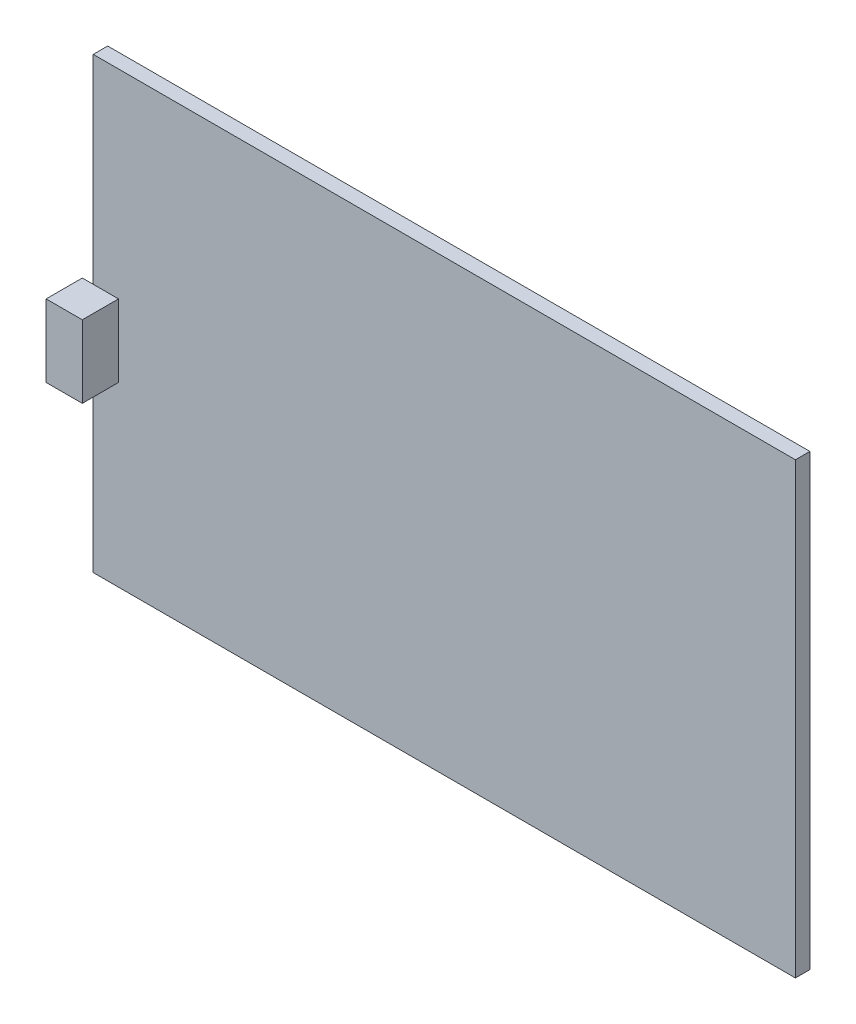
ISO-10303-21;
HEADER;
FILE_DESCRIPTION(('STEP AP214'),'2;1');
FILE_NAME('part.step','',(''),(''),'','','');
FILE_SCHEMA(('AUTOMOTIVE_DESIGN { 1 0 10303 214 1 1 1 1 }'));
ENDSEC;
DATA;
#1=APPLICATION_CONTEXT('core data for automotive mechanical design processes');
#2=APPLICATION_PROTOCOL_DEFINITION('international standard','automotive_design',2000,#1);
#3=PRODUCT_CONTEXT('',#1,'mechanical');
#4=PRODUCT('Part','Part','',(#3));
#5=PRODUCT_RELATED_PRODUCT_CATEGORY('part','',(#4));
#6=PRODUCT_DEFINITION_FORMATION('','',#4);
#7=PRODUCT_DEFINITION_CONTEXT('part definition',#1,'design');
#8=PRODUCT_DEFINITION('design','',#6,#7);
#9=PRODUCT_DEFINITION_SHAPE('','',#8);
#10=(LENGTH_UNIT() NAMED_UNIT(*) SI_UNIT(.MILLI.,.METRE.));
#11=(NAMED_UNIT(*) PLANE_ANGLE_UNIT() SI_UNIT($,.RADIAN.));
#12=(NAMED_UNIT(*) SI_UNIT($,.STERADIAN.) SOLID_ANGLE_UNIT());
#13=UNCERTAINTY_MEASURE_WITH_UNIT(LENGTH_MEASURE(1.E-05),#10,'distance_accuracy_value','');
#14=(GEOMETRIC_REPRESENTATION_CONTEXT(3) GLOBAL_UNCERTAINTY_ASSIGNED_CONTEXT((#13)) GLOBAL_UNIT_ASSIGNED_CONTEXT((#10,
#11,#12)) REPRESENTATION_CONTEXT('',''));
#15=CARTESIAN_POINT('',(0.,0.,0.));
#16=DIRECTION('',(0.,0.,1.));
#17=DIRECTION('',(1.,0.,0.));
#18=AXIS2_PLACEMENT_3D('',#15,#16,#17);
#19=CARTESIAN_POINT('',(-48.1177052875244,23.3333333333333,2.));
#20=DIRECTION('',(1.,0.,0.));
#21=DIRECTION('',(0.,1.,0.));
#22=AXIS2_PLACEMENT_3D('',#19,#20,#21);
#23=PLANE('',#22);
#24=DIRECTION('',(0.,-1.,0.));
#25=VECTOR('',#24,1.);
#26=CARTESIAN_POINT('',(-48.1177052875244,23.3333333333333,0.));
#27=LINE('',#26,#25);
#28=CARTESIAN_POINT('',(-48.1177052875244,23.3333333333333,0.));
#29=VERTEX_POINT('',#28);
#30=CARTESIAN_POINT('',(-48.1177052875244,-38.6666666666667,0.));
#31=VERTEX_POINT('',#30);
#32=EDGE_CURVE('E197',#29,#31,#27,.T.);
#33=ORIENTED_EDGE('',*,*,#32,.T.);
#34=DIRECTION('',(0.,0.,-1.));
#35=VECTOR('',#34,1.);
#36=CARTESIAN_POINT('',(-48.1177052875244,-38.6666666666667,2.));
#37=LINE('',#36,#35);
#38=CARTESIAN_POINT('',(-48.1177052875244,-38.6666666666667,2.));
#39=VERTEX_POINT('',#38);
#40=EDGE_CURVE('E11',#39,#31,#37,.T.);
#41=ORIENTED_EDGE('',*,*,#40,.F.);
#42=DIRECTION('',(0.,-1.,0.));
#43=VECTOR('',#42,1.);
#44=CARTESIAN_POINT('',(-48.1177052875244,23.3333333333333,2.));
#45=LINE('',#44,#43);
#46=CARTESIAN_POINT('',(-48.1177052875244,-9.16666666666667,2.));
#47=VERTEX_POINT('',#46);
#48=EDGE_CURVE('E202',#47,#39,#45,.T.);
#49=ORIENTED_EDGE('',*,*,#48,.F.);
#50=DIRECTION('',(0.,0.,-1.));
#51=VECTOR('',#50,1.);
#52=CARTESIAN_POINT('',(-48.1177052875244,-9.16666666666667,3.51));
#53=LINE('',#52,#51);
#54=CARTESIAN_POINT('',(-48.1177052875244,-9.16666666666667,3.51));
#55=VERTEX_POINT('',#54);
#56=EDGE_CURVE('E193',#55,#47,#53,.T.);
#57=ORIENTED_EDGE('',*,*,#56,.F.);
#58=DIRECTION('',(0.,-1.,0.));
#59=VECTOR('',#58,1.);
#60=CARTESIAN_POINT('',(-48.1177052875244,-2.66666666666667,3.51));
#61=LINE('',#60,#59);
#62=CARTESIAN_POINT('',(-48.1177052875244,-12.6666666666667,3.51));
#63=VERTEX_POINT('',#62);
#64=EDGE_CURVE('E153',#55,#63,#61,.T.);
#65=ORIENTED_EDGE('',*,*,#64,.T.);
#66=DIRECTION('',(0.,0.,-1.));
#67=VECTOR('',#66,1.);
#68=CARTESIAN_POINT('',(-48.1177052875244,-12.6666666666667,8.51));
#69=LINE('',#68,#67);
#70=CARTESIAN_POINT('',(-48.1177052875244,-12.6666666666667,8.51));
#71=VERTEX_POINT('',#70);
#72=EDGE_CURVE('E131',#71,#63,#69,.T.);
#73=ORIENTED_EDGE('',*,*,#72,.F.);
#74=DIRECTION('',(0.,-1.,0.));
#75=VECTOR('',#74,1.);
#76=CARTESIAN_POINT('',(-48.1177052875244,-2.66666666666667,8.51));
#77=LINE('',#76,#75);
#78=CARTESIAN_POINT('',(-48.1177052875244,-2.66666666666667,8.51));
#79=VERTEX_POINT('',#78);
#80=EDGE_CURVE('E138',#79,#71,#77,.T.);
#81=ORIENTED_EDGE('',*,*,#80,.F.);
#82=DIRECTION('',(0.,0.,-1.));
#83=VECTOR('',#82,1.);
#84=CARTESIAN_POINT('',(-48.1177052875244,-2.66666666666667,8.51));
#85=LINE('',#84,#83);
#86=CARTESIAN_POINT('',(-48.1177052875244,-2.66666666666667,3.51));
#87=VERTEX_POINT('',#86);
#88=EDGE_CURVE('E277',#79,#87,#85,.T.);
#89=ORIENTED_EDGE('',*,*,#88,.T.);
#90=CARTESIAN_POINT('',(-48.1177052875244,-6.16666666666667,3.51));
#91=VERTEX_POINT('',#90);
#92=EDGE_CURVE('E264',#87,#91,#61,.T.);
#93=ORIENTED_EDGE('',*,*,#92,.T.);
#94=DIRECTION('',(0.,0.,-1.));
#95=VECTOR('',#94,1.);
#96=CARTESIAN_POINT('',(-48.1177052875244,-6.16666666666667,3.51));
#97=LINE('',#96,#95);
#98=CARTESIAN_POINT('',(-48.1177052875244,-6.16666666666667,2.));
#99=VERTEX_POINT('',#98);
#100=EDGE_CURVE('E176',#91,#99,#97,.T.);
#101=ORIENTED_EDGE('',*,*,#100,.T.);
#102=CARTESIAN_POINT('',(-48.1177052875244,23.3333333333333,2.));
#103=VERTEX_POINT('',#102);
#104=EDGE_CURVE('E198',#103,#99,#45,.T.);
#105=ORIENTED_EDGE('',*,*,#104,.F.);
#106=DIRECTION('',(0.,0.,-1.));
#107=VECTOR('',#106,1.);
#108=CARTESIAN_POINT('',(-48.1177052875244,23.3333333333333,2.));
#109=LINE('',#108,#107);
#110=EDGE_CURVE('E211',#103,#29,#109,.T.);
#111=ORIENTED_EDGE('',*,*,#110,.T.);
#112=EDGE_LOOP('',(#33,#41,#49,#57,#65,#73,#81,#89,#93,#101,#105,#111));
#113=FACE_BOUND('',#112,.T.);
#114=ADVANCED_FACE('F39',(#113),#23,.F.);
#115=CARTESIAN_POINT('',(-48.1177052875244,-38.6666666666667,2.));
#116=DIRECTION('',(0.,1.,0.));
#117=DIRECTION('',(0.,0.,1.));
#118=AXIS2_PLACEMENT_3D('',#115,#116,#117);
#119=PLANE('',#118);
#120=DIRECTION('',(1.,0.,0.));
#121=VECTOR('',#120,1.);
#122=CARTESIAN_POINT('',(-48.1177052875244,-38.6666666666667,0.));
#123=LINE('',#122,#121);
#124=CARTESIAN_POINT('',(48.8822947124756,-38.6666666666667,0.));
#125=VERTEX_POINT('',#124);
#126=EDGE_CURVE('E214',#31,#125,#123,.T.);
#127=ORIENTED_EDGE('',*,*,#126,.T.);
#128=DIRECTION('',(0.,0.,-1.));
#129=VECTOR('',#128,1.);
#130=CARTESIAN_POINT('',(48.8822947124756,-38.6666666666667,2.));
#131=LINE('',#130,#129);
#132=CARTESIAN_POINT('',(48.8822947124756,-38.6666666666667,2.));
#133=VERTEX_POINT('',#132);
#134=EDGE_CURVE('E47',#133,#125,#131,.T.);
#135=ORIENTED_EDGE('',*,*,#134,.F.);
#136=DIRECTION('',(1.,0.,0.));
#137=VECTOR('',#136,1.);
#138=CARTESIAN_POINT('',(-48.1177052875244,-38.6666666666667,2.));
#139=LINE('',#138,#137);
#140=EDGE_CURVE('E201',#39,#133,#139,.T.);
#141=ORIENTED_EDGE('',*,*,#140,.F.);
#142=ORIENTED_EDGE('',*,*,#40,.T.);
#143=EDGE_LOOP('',(#127,#135,#141,#142));
#144=FACE_BOUND('',#143,.T.);
#145=ADVANCED_FACE('F299',(#144),#119,.F.);
#146=CARTESIAN_POINT('',(48.8822947124756,23.3333333333333,2.));
#147=DIRECTION('',(-1.,0.,0.));
#148=DIRECTION('',(0.,0.,1.));
#149=AXIS2_PLACEMENT_3D('',#146,#147,#148);
#150=PLANE('',#149);
#151=DIRECTION('',(0.,1.,0.));
#152=VECTOR('',#151,1.);
#153=CARTESIAN_POINT('',(48.8822947124756,23.3333333333333,0.));
#154=LINE('',#153,#152);
#155=CARTESIAN_POINT('',(48.8822947124756,23.3333333333333,0.));
#156=VERTEX_POINT('',#155);
#157=EDGE_CURVE('E217',#125,#156,#154,.T.);
#158=ORIENTED_EDGE('',*,*,#157,.T.);
#159=DIRECTION('',(0.,0.,-1.));
#160=VECTOR('',#159,1.);
#161=CARTESIAN_POINT('',(48.8822947124756,23.3333333333333,2.));
#162=LINE('',#161,#160);
#163=CARTESIAN_POINT('',(48.8822947124756,23.3333333333333,2.));
#164=VERTEX_POINT('',#163);
#165=EDGE_CURVE('E226',#164,#156,#162,.T.);
#166=ORIENTED_EDGE('',*,*,#165,.F.);
#167=DIRECTION('',(0.,1.,0.));
#168=VECTOR('',#167,1.);
#169=CARTESIAN_POINT('',(48.8822947124756,23.3333333333333,2.));
#170=LINE('',#169,#168);
#171=EDGE_CURVE('E205',#133,#164,#170,.T.);
#172=ORIENTED_EDGE('',*,*,#171,.F.);
#173=ORIENTED_EDGE('',*,*,#134,.T.);
#174=EDGE_LOOP('',(#158,#166,#172,#173));
#175=FACE_BOUND('',#174,.T.);
#176=ADVANCED_FACE('F235',(#175),#150,.F.);
#177=CARTESIAN_POINT('',(-48.1177052875244,23.3333333333333,2.));
#178=DIRECTION('',(0.,-1.,0.));
#179=DIRECTION('',(0.,0.,-1.));
#180=AXIS2_PLACEMENT_3D('',#177,#178,#179);
#181=PLANE('',#180);
#182=DIRECTION('',(-1.,0.,0.));
#183=VECTOR('',#182,1.);
#184=CARTESIAN_POINT('',(-48.1177052875244,23.3333333333333,0.));
#185=LINE('',#184,#183);
#186=EDGE_CURVE('E220',#156,#29,#185,.T.);
#187=ORIENTED_EDGE('',*,*,#186,.T.);
#188=ORIENTED_EDGE('',*,*,#110,.F.);
#189=DIRECTION('',(-1.,0.,0.));
#190=VECTOR('',#189,1.);
#191=CARTESIAN_POINT('',(-48.1177052875244,23.3333333333333,2.));
#192=LINE('',#191,#190);
#193=EDGE_CURVE('E208',#164,#103,#192,.T.);
#194=ORIENTED_EDGE('',*,*,#193,.F.);
#195=ORIENTED_EDGE('',*,*,#165,.T.);
#196=EDGE_LOOP('',(#187,#188,#194,#195));
#197=FACE_BOUND('',#196,.T.);
#198=ADVANCED_FACE('F245',(#197),#181,.F.);
#199=CARTESIAN_POINT('',(0.,0.,2.));
#200=DIRECTION('',(0.,0.,1.));
#201=DIRECTION('',(1.,0.,0.));
#202=AXIS2_PLACEMENT_3D('',#199,#200,#201);
#203=PLANE('',#202);
#204=DIRECTION('',(-1.,0.,0.));
#205=VECTOR('',#204,1.);
#206=CARTESIAN_POINT('',(-48.1177052875244,-6.16666666666667,2.));
#207=LINE('',#206,#205);
#208=CARTESIAN_POINT('',(-46.6077052875244,-6.16666666666667,2.));
#209=VERTEX_POINT('',#208);
#210=EDGE_CURVE('E54',#209,#99,#207,.T.);
#211=ORIENTED_EDGE('',*,*,#210,.F.);
#212=DIRECTION('',(0.,1.,0.));
#213=VECTOR('',#212,1.);
#214=CARTESIAN_POINT('',(-46.6077052875244,-6.16666666666667,2.));
#215=LINE('',#214,#213);
#216=CARTESIAN_POINT('',(-46.6077052875244,-9.16666666666667,2.));
#217=VERTEX_POINT('',#216);
#218=EDGE_CURVE('E159',#217,#209,#215,.T.);
#219=ORIENTED_EDGE('',*,*,#218,.F.);
#220=DIRECTION('',(1.,0.,0.));
#221=VECTOR('',#220,1.);
#222=CARTESIAN_POINT('',(-48.1177052875244,-9.16666666666667,2.));
#223=LINE('',#222,#221);
#224=EDGE_CURVE('E60',#47,#217,#223,.T.);
#225=ORIENTED_EDGE('',*,*,#224,.F.);
#226=ORIENTED_EDGE('',*,*,#48,.T.);
#227=ORIENTED_EDGE('',*,*,#140,.T.);
#228=ORIENTED_EDGE('',*,*,#171,.T.);
#229=ORIENTED_EDGE('',*,*,#193,.T.);
#230=ORIENTED_EDGE('',*,*,#104,.T.);
#231=EDGE_LOOP('',(#211,#219,#225,#226,#227,#228,#229,#230));
#232=FACE_BOUND('',#231,.T.);
#233=ADVANCED_FACE('F250',(#232),#203,.T.);
#234=CARTESIAN_POINT('',(0.,0.,0.));
#235=DIRECTION('',(0.,0.,1.));
#236=DIRECTION('',(1.,0.,0.));
#237=AXIS2_PLACEMENT_3D('',#234,#235,#236);
#238=PLANE('',#237);
#239=ORIENTED_EDGE('',*,*,#32,.F.);
#240=ORIENTED_EDGE('',*,*,#186,.F.);
#241=ORIENTED_EDGE('',*,*,#157,.F.);
#242=ORIENTED_EDGE('',*,*,#126,.F.);
#243=EDGE_LOOP('',(#239,#240,#241,#242));
#244=FACE_BOUND('',#243,.T.);
#245=ADVANCED_FACE('F242',(#244),#238,.F.);
#246=CARTESIAN_POINT('',(-48.1177052875244,-9.16666666666667,3.51));
#247=DIRECTION('',(0.,1.,0.));
#248=DIRECTION('',(0.,0.,1.));
#249=AXIS2_PLACEMENT_3D('',#246,#247,#248);
#250=PLANE('',#249);
#251=ORIENTED_EDGE('',*,*,#224,.T.);
#252=DIRECTION('',(0.,0.,-1.));
#253=VECTOR('',#252,1.);
#254=CARTESIAN_POINT('',(-46.6077052875244,-9.16666666666667,3.51));
#255=LINE('',#254,#253);
#256=CARTESIAN_POINT('',(-46.6077052875244,-9.16666666666667,3.51));
#257=VERTEX_POINT('',#256);
#258=EDGE_CURVE('E189',#257,#217,#255,.T.);
#259=ORIENTED_EDGE('',*,*,#258,.F.);
#260=DIRECTION('',(1.,0.,0.));
#261=VECTOR('',#260,1.);
#262=CARTESIAN_POINT('',(-48.1177052875244,-9.16666666666667,3.51));
#263=LINE('',#262,#261);
#264=EDGE_CURVE('E165',#55,#257,#263,.T.);
#265=ORIENTED_EDGE('',*,*,#264,.F.);
#266=ORIENTED_EDGE('',*,*,#56,.T.);
#267=EDGE_LOOP('',(#251,#259,#265,#266));
#268=FACE_BOUND('',#267,.T.);
#269=ADVANCED_FACE('F258',(#268),#250,.F.);
#270=CARTESIAN_POINT('',(-46.6077052875244,-6.16666666666667,3.51));
#271=DIRECTION('',(-1.,0.,0.));
#272=DIRECTION('',(0.,0.,1.));
#273=AXIS2_PLACEMENT_3D('',#270,#271,#272);
#274=PLANE('',#273);
#275=ORIENTED_EDGE('',*,*,#218,.T.);
#276=DIRECTION('',(0.,0.,-1.));
#277=VECTOR('',#276,1.);
#278=CARTESIAN_POINT('',(-46.6077052875244,-6.16666666666667,3.51));
#279=LINE('',#278,#277);
#280=CARTESIAN_POINT('',(-46.6077052875244,-6.16666666666667,3.51));
#281=VERTEX_POINT('',#280);
#282=EDGE_CURVE('E185',#281,#209,#279,.T.);
#283=ORIENTED_EDGE('',*,*,#282,.F.);
#284=DIRECTION('',(0.,1.,0.));
#285=VECTOR('',#284,1.);
#286=CARTESIAN_POINT('',(-46.6077052875244,-6.16666666666667,3.51));
#287=LINE('',#286,#285);
#288=EDGE_CURVE('E169',#257,#281,#287,.T.);
#289=ORIENTED_EDGE('',*,*,#288,.F.);
#290=ORIENTED_EDGE('',*,*,#258,.T.);
#291=EDGE_LOOP('',(#275,#283,#289,#290));
#292=FACE_BOUND('',#291,.T.);
#293=ADVANCED_FACE('F256',(#292),#274,.F.);
#294=CARTESIAN_POINT('',(-48.1177052875244,-6.16666666666667,3.51));
#295=DIRECTION('',(0.,-1.,0.));
#296=DIRECTION('',(0.,0.,-1.));
#297=AXIS2_PLACEMENT_3D('',#294,#295,#296);
#298=PLANE('',#297);
#299=ORIENTED_EDGE('',*,*,#210,.T.);
#300=ORIENTED_EDGE('',*,*,#100,.F.);
#301=DIRECTION('',(-1.,0.,0.));
#302=VECTOR('',#301,1.);
#303=CARTESIAN_POINT('',(-48.1177052875244,-6.16666666666667,3.51));
#304=LINE('',#303,#302);
#305=EDGE_CURVE('E173',#281,#91,#304,.T.);
#306=ORIENTED_EDGE('',*,*,#305,.F.);
#307=ORIENTED_EDGE('',*,*,#282,.T.);
#308=EDGE_LOOP('',(#299,#300,#306,#307));
#309=FACE_BOUND('',#308,.T.);
#310=ADVANCED_FACE('F252',(#309),#298,.F.);
#311=CARTESIAN_POINT('',(0.,0.,3.51));
#312=DIRECTION('',(0.,0.,1.));
#313=DIRECTION('',(1.,0.,0.));
#314=AXIS2_PLACEMENT_3D('',#311,#312,#313);
#315=PLANE('',#314);
#316=ORIENTED_EDGE('',*,*,#64,.F.);
#317=ORIENTED_EDGE('',*,*,#264,.T.);
#318=ORIENTED_EDGE('',*,*,#288,.T.);
#319=ORIENTED_EDGE('',*,*,#305,.T.);
#320=ORIENTED_EDGE('',*,*,#92,.F.);
#321=DIRECTION('',(-1.,0.,0.));
#322=VECTOR('',#321,1.);
#323=CARTESIAN_POINT('',(-48.1177052875244,-2.66666666666667,3.51));
#324=LINE('',#323,#322);
#325=CARTESIAN_POINT('',(-43.1177052875244,-2.66666666666667,3.51));
#326=VERTEX_POINT('',#325);
#327=EDGE_CURVE('E148',#326,#87,#324,.T.);
#328=ORIENTED_EDGE('',*,*,#327,.F.);
#329=DIRECTION('',(0.,1.,0.));
#330=VECTOR('',#329,1.);
#331=CARTESIAN_POINT('',(-43.1177052875244,-2.66666666666667,3.51));
#332=LINE('',#331,#330);
#333=CARTESIAN_POINT('',(-43.1177052875244,-12.6666666666667,3.51));
#334=VERTEX_POINT('',#333);
#335=EDGE_CURVE('E272',#334,#326,#332,.T.);
#336=ORIENTED_EDGE('',*,*,#335,.F.);
#337=DIRECTION('',(1.,0.,0.));
#338=VECTOR('',#337,1.);
#339=CARTESIAN_POINT('',(-48.1177052875244,-12.6666666666667,3.51));
#340=LINE('',#339,#338);
#341=EDGE_CURVE('E262',#63,#334,#340,.T.);
#342=ORIENTED_EDGE('',*,*,#341,.F.);
#343=EDGE_LOOP('',(#316,#317,#318,#319,#320,#328,#336,#342));
#344=FACE_BOUND('',#343,.T.);
#345=ADVANCED_FACE('F260',(#344),#315,.F.);
#346=CARTESIAN_POINT('',(-48.1177052875244,-12.6666666666667,8.51));
#347=DIRECTION('',(0.,1.,0.));
#348=DIRECTION('',(0.,0.,1.));
#349=AXIS2_PLACEMENT_3D('',#346,#347,#348);
#350=PLANE('',#349);
#351=ORIENTED_EDGE('',*,*,#341,.T.);
#352=DIRECTION('',(0.,0.,-1.));
#353=VECTOR('',#352,1.);
#354=CARTESIAN_POINT('',(-43.1177052875244,-12.6666666666667,8.51));
#355=LINE('',#354,#353);
#356=CARTESIAN_POINT('',(-43.1177052875244,-12.6666666666667,8.51));
#357=VERTEX_POINT('',#356);
#358=EDGE_CURVE('E133',#357,#334,#355,.T.);
#359=ORIENTED_EDGE('',*,*,#358,.F.);
#360=DIRECTION('',(1.,0.,0.));
#361=VECTOR('',#360,1.);
#362=CARTESIAN_POINT('',(-48.1177052875244,-12.6666666666667,8.51));
#363=LINE('',#362,#361);
#364=EDGE_CURVE('E127',#71,#357,#363,.T.);
#365=ORIENTED_EDGE('',*,*,#364,.F.);
#366=ORIENTED_EDGE('',*,*,#72,.T.);
#367=EDGE_LOOP('',(#351,#359,#365,#366));
#368=FACE_BOUND('',#367,.T.);
#369=ADVANCED_FACE('F129',(#368),#350,.F.);
#370=CARTESIAN_POINT('',(-43.1177052875244,-2.66666666666667,8.51));
#371=DIRECTION('',(-1.,0.,0.));
#372=DIRECTION('',(0.,0.,1.));
#373=AXIS2_PLACEMENT_3D('',#370,#371,#372);
#374=PLANE('',#373);
#375=ORIENTED_EDGE('',*,*,#335,.T.);
#376=DIRECTION('',(0.,0.,-1.));
#377=VECTOR('',#376,1.);
#378=CARTESIAN_POINT('',(-43.1177052875244,-2.66666666666667,8.51));
#379=LINE('',#378,#377);
#380=CARTESIAN_POINT('',(-43.1177052875244,-2.66666666666667,8.51));
#381=VERTEX_POINT('',#380);
#382=EDGE_CURVE('E161',#381,#326,#379,.T.);
#383=ORIENTED_EDGE('',*,*,#382,.F.);
#384=DIRECTION('',(0.,1.,0.));
#385=VECTOR('',#384,1.);
#386=CARTESIAN_POINT('',(-43.1177052875244,-2.66666666666667,8.51));
#387=LINE('',#386,#385);
#388=EDGE_CURVE('E137',#357,#381,#387,.T.);
#389=ORIENTED_EDGE('',*,*,#388,.F.);
#390=ORIENTED_EDGE('',*,*,#358,.T.);
#391=EDGE_LOOP('',(#375,#383,#389,#390));
#392=FACE_BOUND('',#391,.T.);
#393=ADVANCED_FACE('F287',(#392),#374,.F.);
#394=CARTESIAN_POINT('',(-48.1177052875244,-2.66666666666667,8.51));
#395=DIRECTION('',(0.,-1.,0.));
#396=DIRECTION('',(1.,0.,0.));
#397=AXIS2_PLACEMENT_3D('',#394,#395,#396);
#398=PLANE('',#397);
#399=ORIENTED_EDGE('',*,*,#327,.T.);
#400=ORIENTED_EDGE('',*,*,#88,.F.);
#401=DIRECTION('',(-1.,0.,0.));
#402=VECTOR('',#401,1.);
#403=CARTESIAN_POINT('',(-48.1177052875244,-2.66666666666667,8.51));
#404=LINE('',#403,#402);
#405=EDGE_CURVE('E143',#381,#79,#404,.T.);
#406=ORIENTED_EDGE('',*,*,#405,.F.);
#407=ORIENTED_EDGE('',*,*,#382,.T.);
#408=EDGE_LOOP('',(#399,#400,#406,#407));
#409=FACE_BOUND('',#408,.T.);
#410=ADVANCED_FACE('F284',(#409),#398,.F.);
#411=CARTESIAN_POINT('',(0.,0.,8.51));
#412=DIRECTION('',(0.,0.,1.));
#413=DIRECTION('',(1.,0.,0.));
#414=AXIS2_PLACEMENT_3D('',#411,#412,#413);
#415=PLANE('',#414);
#416=ORIENTED_EDGE('',*,*,#80,.T.);
#417=ORIENTED_EDGE('',*,*,#364,.T.);
#418=ORIENTED_EDGE('',*,*,#388,.T.);
#419=ORIENTED_EDGE('',*,*,#405,.T.);
#420=EDGE_LOOP('',(#416,#417,#418,#419));
#421=FACE_BOUND('',#420,.T.);
#422=ADVANCED_FACE('F141',(#421),#415,.T.);
#423=CLOSED_SHELL('',(#114,#145,#176,#198,#233,#245,#269,#293,#310,#345,#369,#393,#410,#422));
#424=MANIFOLD_SOLID_BREP('B2',#423);
#425=ADVANCED_BREP_SHAPE_REPRESENTATION('',(#18,#424),#14);
#426=SHAPE_DEFINITION_REPRESENTATION(#9,#425);
ENDSEC;
END-ISO-10303-21;
